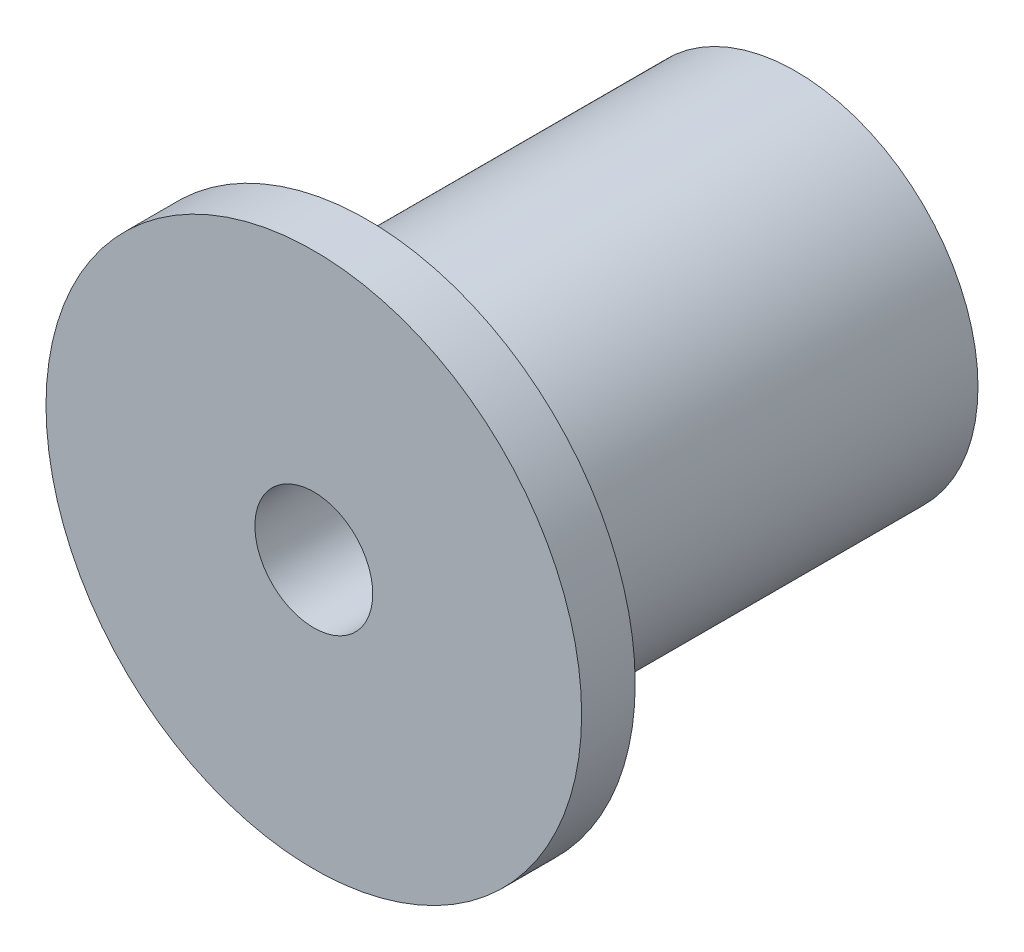
ISO-10303-21;
HEADER;
FILE_DESCRIPTION(('STEP AP214'),'2;1');
FILE_NAME('part.step','',(''),(''),'','','');
FILE_SCHEMA(('AUTOMOTIVE_DESIGN { 1 0 10303 214 1 1 1 1 }'));
ENDSEC;
DATA;
#1=APPLICATION_CONTEXT('core data for automotive mechanical design processes');
#2=APPLICATION_PROTOCOL_DEFINITION('international standard','automotive_design',2000,#1);
#3=PRODUCT_CONTEXT('',#1,'mechanical');
#4=PRODUCT('Part','Part','',(#3));
#5=PRODUCT_RELATED_PRODUCT_CATEGORY('part','',(#4));
#6=PRODUCT_DEFINITION_FORMATION('','',#4);
#7=PRODUCT_DEFINITION_CONTEXT('part definition',#1,'design');
#8=PRODUCT_DEFINITION('design','',#6,#7);
#9=PRODUCT_DEFINITION_SHAPE('','',#8);
#10=(LENGTH_UNIT() NAMED_UNIT(*) SI_UNIT(.MILLI.,.METRE.));
#11=(NAMED_UNIT(*) PLANE_ANGLE_UNIT() SI_UNIT($,.RADIAN.));
#12=(NAMED_UNIT(*) SI_UNIT($,.STERADIAN.) SOLID_ANGLE_UNIT());
#13=UNCERTAINTY_MEASURE_WITH_UNIT(LENGTH_MEASURE(1.E-05),#10,'distance_accuracy_value','');
#14=(GEOMETRIC_REPRESENTATION_CONTEXT(3) GLOBAL_UNCERTAINTY_ASSIGNED_CONTEXT((#13)) GLOBAL_UNIT_ASSIGNED_CONTEXT((#10,
#11,#12)) REPRESENTATION_CONTEXT('',''));
#15=CARTESIAN_POINT('',(0.,0.,0.));
#16=DIRECTION('',(0.,0.,1.));
#17=DIRECTION('',(1.,0.,0.));
#18=AXIS2_PLACEMENT_3D('',#15,#16,#17);
#19=CARTESIAN_POINT('',(0.,0.,0.));
#20=DIRECTION('',(0.,0.,1.));
#21=DIRECTION('',(1.,0.,0.));
#22=AXIS2_PLACEMENT_3D('',#19,#20,#21);
#23=PLANE('',#22);
#24=CARTESIAN_POINT('',(0.,0.,0.));
#25=DIRECTION('',(0.,0.,1.));
#26=DIRECTION('',(1.,0.,0.));
#27=AXIS2_PLACEMENT_3D('',#24,#25,#26);
#28=CIRCLE('',#27,8.636);
#29=CARTESIAN_POINT('',(8.636,0.,0.));
#30=VERTEX_POINT('',#29);
#31=EDGE_CURVE('E39',#30,#30,#28,.T.);
#32=ORIENTED_EDGE('',*,*,#31,.F.);
#33=EDGE_LOOP('',(#32));
#34=FACE_BOUND('',#33,.T.);
#35=CARTESIAN_POINT('',(0.,0.,0.));
#36=DIRECTION('',(0.,0.,1.));
#37=DIRECTION('',(1.,0.,0.));
#38=AXIS2_PLACEMENT_3D('',#35,#36,#37);
#39=CIRCLE('',#38,2.794);
#40=CARTESIAN_POINT('',(2.794,0.,0.));
#41=VERTEX_POINT('',#40);
#42=EDGE_CURVE('E46',#41,#41,#39,.T.);
#43=ORIENTED_EDGE('',*,*,#42,.T.);
#44=EDGE_LOOP('',(#43));
#45=FACE_BOUND('',#44,.T.);
#46=ADVANCED_FACE('F35',(#34,#45),#23,.F.);
#47=CARTESIAN_POINT('',(0.,0.,20.32));
#48=DIRECTION('',(0.,0.,-1.));
#49=DIRECTION('',(-1.,0.,0.));
#50=AXIS2_PLACEMENT_3D('',#47,#48,#49);
#51=CYLINDRICAL_SURFACE('',#50,8.636);
#52=CARTESIAN_POINT('',(0.,0.,20.32));
#53=DIRECTION('',(0.,0.,1.));
#54=DIRECTION('',(1.,0.,0.));
#55=AXIS2_PLACEMENT_3D('',#52,#53,#54);
#56=CIRCLE('',#55,8.636);
#57=CARTESIAN_POINT('',(8.636,0.,20.32));
#58=VERTEX_POINT('',#57);
#59=EDGE_CURVE('E10',#58,#58,#56,.T.);
#60=ORIENTED_EDGE('',*,*,#59,.F.);
#61=EDGE_LOOP('',(#60));
#62=FACE_BOUND('',#61,.T.);
#63=ORIENTED_EDGE('',*,*,#31,.T.);
#64=EDGE_LOOP('',(#63));
#65=FACE_BOUND('',#64,.T.);
#66=ADVANCED_FACE('F37',(#62,#65),#51,.T.);
#67=CARTESIAN_POINT('',(0.,0.,20.32));
#68=DIRECTION('',(0.,0.,-1.));
#69=DIRECTION('',(-1.,0.,0.));
#70=AXIS2_PLACEMENT_3D('',#67,#68,#69);
#71=CYLINDRICAL_SURFACE('',#70,2.794);
#72=ORIENTED_EDGE('',*,*,#42,.F.);
#73=EDGE_LOOP('',(#72));
#74=FACE_BOUND('',#73,.T.);
#75=CARTESIAN_POINT('',(0.,0.,22.86));
#76=DIRECTION('',(0.,0.,1.));
#77=DIRECTION('',(1.,0.,0.));
#78=AXIS2_PLACEMENT_3D('',#75,#76,#77);
#79=CIRCLE('',#78,2.794);
#80=CARTESIAN_POINT('',(2.794,0.,22.86));
#81=VERTEX_POINT('',#80);
#82=EDGE_CURVE('E54',#81,#81,#79,.T.);
#83=ORIENTED_EDGE('',*,*,#82,.T.);
#84=EDGE_LOOP('',(#83));
#85=FACE_BOUND('',#84,.T.);
#86=ADVANCED_FACE('F60',(#74,#85),#71,.F.);
#87=CARTESIAN_POINT('',(0.,0.,22.86));
#88=DIRECTION('',(0.,0.,1.));
#89=DIRECTION('',(1.,0.,0.));
#90=AXIS2_PLACEMENT_3D('',#87,#88,#89);
#91=PLANE('',#90);
#92=CARTESIAN_POINT('',(0.,0.,22.86));
#93=DIRECTION('',(0.,0.,1.));
#94=DIRECTION('',(1.,0.,0.));
#95=AXIS2_PLACEMENT_3D('',#92,#93,#94);
#96=CIRCLE('',#95,12.7);
#97=CARTESIAN_POINT('',(12.7,0.,22.86));
#98=VERTEX_POINT('',#97);
#99=EDGE_CURVE('E50',#98,#98,#96,.T.);
#100=ORIENTED_EDGE('',*,*,#99,.T.);
#101=EDGE_LOOP('',(#100));
#102=FACE_BOUND('',#101,.T.);
#103=ORIENTED_EDGE('',*,*,#82,.F.);
#104=EDGE_LOOP('',(#103));
#105=FACE_BOUND('',#104,.T.);
#106=ADVANCED_FACE('F62',(#102,#105),#91,.T.);
#107=CARTESIAN_POINT('',(0.,0.,20.32));
#108=DIRECTION('',(0.,0.,1.));
#109=DIRECTION('',(1.,0.,0.));
#110=AXIS2_PLACEMENT_3D('',#107,#108,#109);
#111=PLANE('',#110);
#112=ORIENTED_EDGE('',*,*,#59,.T.);
#113=EDGE_LOOP('',(#112));
#114=FACE_BOUND('',#113,.T.);
#115=CARTESIAN_POINT('',(0.,0.,20.32));
#116=DIRECTION('',(0.,0.,1.));
#117=DIRECTION('',(1.,0.,0.));
#118=AXIS2_PLACEMENT_3D('',#115,#116,#117);
#119=CIRCLE('',#118,12.7);
#120=CARTESIAN_POINT('',(12.7,0.,20.32));
#121=VERTEX_POINT('',#120);
#122=EDGE_CURVE('E51',#121,#121,#119,.T.);
#123=ORIENTED_EDGE('',*,*,#122,.F.);
#124=EDGE_LOOP('',(#123));
#125=FACE_BOUND('',#124,.T.);
#126=ADVANCED_FACE('F64',(#114,#125),#111,.F.);
#127=CARTESIAN_POINT('',(0.,0.,22.86));
#128=DIRECTION('',(0.,0.,-1.));
#129=DIRECTION('',(-1.,0.,0.));
#130=AXIS2_PLACEMENT_3D('',#127,#128,#129);
#131=CYLINDRICAL_SURFACE('',#130,12.7);
#132=ORIENTED_EDGE('',*,*,#99,.F.);
#133=EDGE_LOOP('',(#132));
#134=FACE_BOUND('',#133,.T.);
#135=ORIENTED_EDGE('',*,*,#122,.T.);
#136=EDGE_LOOP('',(#135));
#137=FACE_BOUND('',#136,.T.);
#138=ADVANCED_FACE('F71',(#134,#137),#131,.T.);
#139=CLOSED_SHELL('',(#46,#66,#86,#106,#126,#138));
#140=MANIFOLD_SOLID_BREP('B2',#139);
#141=ADVANCED_BREP_SHAPE_REPRESENTATION('',(#18,#140),#14);
#142=SHAPE_DEFINITION_REPRESENTATION(#9,#141);
ENDSEC;
END-ISO-10303-21;
